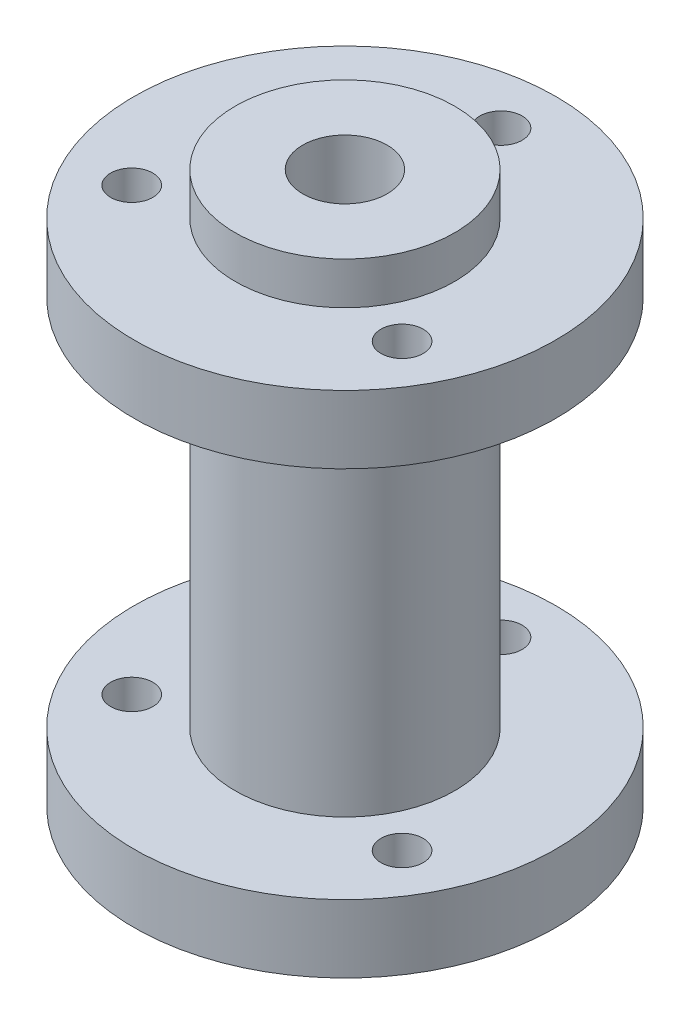
ISO-10303-21;
HEADER;
FILE_DESCRIPTION(('STEP AP214'),'2;1');
FILE_NAME('part.step','',(''),(''),'','','');
FILE_SCHEMA(('AUTOMOTIVE_DESIGN { 1 0 10303 214 1 1 1 1 }'));
ENDSEC;
DATA;
#1=APPLICATION_CONTEXT('core data for automotive mechanical design processes');
#2=APPLICATION_PROTOCOL_DEFINITION('international standard','automotive_design',2000,#1);
#3=PRODUCT_CONTEXT('',#1,'mechanical');
#4=PRODUCT('Part','Part','',(#3));
#5=PRODUCT_RELATED_PRODUCT_CATEGORY('part','',(#4));
#6=PRODUCT_DEFINITION_FORMATION('','',#4);
#7=PRODUCT_DEFINITION_CONTEXT('part definition',#1,'design');
#8=PRODUCT_DEFINITION('design','',#6,#7);
#9=PRODUCT_DEFINITION_SHAPE('','',#8);
#10=(LENGTH_UNIT() NAMED_UNIT(*) SI_UNIT(.MILLI.,.METRE.));
#11=(NAMED_UNIT(*) PLANE_ANGLE_UNIT() SI_UNIT($,.RADIAN.));
#12=(NAMED_UNIT(*) SI_UNIT($,.STERADIAN.) SOLID_ANGLE_UNIT());
#13=UNCERTAINTY_MEASURE_WITH_UNIT(LENGTH_MEASURE(1.E-05),#10,'distance_accuracy_value','');
#14=(GEOMETRIC_REPRESENTATION_CONTEXT(3) GLOBAL_UNCERTAINTY_ASSIGNED_CONTEXT((#13)) GLOBAL_UNIT_ASSIGNED_CONTEXT((#10,
#11,#12)) REPRESENTATION_CONTEXT('',''));
#15=CARTESIAN_POINT('',(0.,0.,0.));
#16=DIRECTION('',(0.,0.,1.));
#17=DIRECTION('',(1.,0.,0.));
#18=AXIS2_PLACEMENT_3D('',#15,#16,#17);
#19=CARTESIAN_POINT('',(0.,0.,0.));
#20=DIRECTION('',(0.,-1.,0.));
#21=DIRECTION('',(0.,0.,-1.));
#22=AXIS2_PLACEMENT_3D('',#19,#20,#21);
#23=CYLINDRICAL_SURFACE('',#22,4.5);
#24=CARTESIAN_POINT('',(0.,-12.56,0.));
#25=DIRECTION('',(0.,-1.,0.));
#26=DIRECTION('',(0.,0.,-1.));
#27=AXIS2_PLACEMENT_3D('',#24,#25,#26);
#28=CIRCLE('',#27,4.5);
#29=CARTESIAN_POINT('',(0.,-12.56,-4.5));
#30=VERTEX_POINT('',#29);
#31=EDGE_CURVE('E10',#30,#30,#28,.T.);
#32=ORIENTED_EDGE('',*,*,#31,.T.);
#33=EDGE_LOOP('',(#32));
#34=FACE_BOUND('',#33,.T.);
#35=CARTESIAN_POINT('',(0.,12.56,0.));
#36=DIRECTION('',(0.,-1.,0.));
#37=DIRECTION('',(0.,0.,-1.));
#38=AXIS2_PLACEMENT_3D('',#35,#36,#37);
#39=CIRCLE('',#38,4.5);
#40=CARTESIAN_POINT('',(0.,12.56,-4.5));
#41=VERTEX_POINT('',#40);
#42=EDGE_CURVE('E84',#41,#41,#39,.T.);
#43=ORIENTED_EDGE('',*,*,#42,.F.);
#44=EDGE_LOOP('',(#43));
#45=FACE_BOUND('',#44,.T.);
#46=ADVANCED_FACE('F32',(#34,#45),#23,.F.);
#47=CARTESIAN_POINT('',(2.5,-12.56,0.));
#48=DIRECTION('',(0.,1.,0.));
#49=DIRECTION('',(0.,0.,1.));
#50=AXIS2_PLACEMENT_3D('',#47,#48,#49);
#51=PLANE('',#50);
#52=CARTESIAN_POINT('',(0.,-12.56,0.));
#53=DIRECTION('',(0.,-1.,0.));
#54=DIRECTION('',(0.,0.,-1.));
#55=AXIS2_PLACEMENT_3D('',#52,#53,#54);
#56=CIRCLE('',#55,2.5);
#57=CARTESIAN_POINT('',(0.,-12.56,-2.5));
#58=VERTEX_POINT('',#57);
#59=EDGE_CURVE('E38',#58,#58,#56,.T.);
#60=ORIENTED_EDGE('',*,*,#59,.T.);
#61=EDGE_LOOP('',(#60));
#62=FACE_BOUND('',#61,.T.);
#63=ORIENTED_EDGE('',*,*,#31,.F.);
#64=EDGE_LOOP('',(#63));
#65=FACE_BOUND('',#64,.T.);
#66=ADVANCED_FACE('F193',(#62,#65),#51,.T.);
#67=CARTESIAN_POINT('',(0.,0.,0.));
#68=DIRECTION('',(0.,-1.,0.));
#69=DIRECTION('',(0.,0.,-1.));
#70=AXIS2_PLACEMENT_3D('',#67,#68,#69);
#71=CYLINDRICAL_SURFACE('',#70,2.5);
#72=CARTESIAN_POINT('',(0.,-17.56,0.));
#73=DIRECTION('',(0.,-1.,0.));
#74=DIRECTION('',(0.,0.,-1.));
#75=AXIS2_PLACEMENT_3D('',#72,#73,#74);
#76=CIRCLE('',#75,2.5);
#77=CARTESIAN_POINT('',(0.,-17.56,-2.5));
#78=VERTEX_POINT('',#77);
#79=EDGE_CURVE('E42',#78,#78,#76,.T.);
#80=ORIENTED_EDGE('',*,*,#79,.T.);
#81=EDGE_LOOP('',(#80));
#82=FACE_BOUND('',#81,.T.);
#83=ORIENTED_EDGE('',*,*,#59,.F.);
#84=EDGE_LOOP('',(#83));
#85=FACE_BOUND('',#84,.T.);
#86=ADVANCED_FACE('F187',(#82,#85),#71,.F.);
#87=CARTESIAN_POINT('',(6.495,-17.56,0.));
#88=DIRECTION('',(0.,-1.,0.));
#89=DIRECTION('',(0.,0.,-1.));
#90=AXIS2_PLACEMENT_3D('',#87,#88,#89);
#91=PLANE('',#90);
#92=CARTESIAN_POINT('',(0.,-17.56,0.));
#93=DIRECTION('',(0.,-1.,0.));
#94=DIRECTION('',(0.,0.,-1.));
#95=AXIS2_PLACEMENT_3D('',#92,#93,#94);
#96=CIRCLE('',#95,6.495);
#97=CARTESIAN_POINT('',(0.,-17.56,-6.495));
#98=VERTEX_POINT('',#97);
#99=EDGE_CURVE('E46',#98,#98,#96,.T.);
#100=ORIENTED_EDGE('',*,*,#99,.T.);
#101=EDGE_LOOP('',(#100));
#102=FACE_BOUND('',#101,.T.);
#103=ORIENTED_EDGE('',*,*,#79,.F.);
#104=EDGE_LOOP('',(#103));
#105=FACE_BOUND('',#104,.T.);
#106=ADVANCED_FACE('F181',(#102,#105),#91,.T.);
#107=CARTESIAN_POINT('',(0.,0.,0.));
#108=DIRECTION('',(0.,-1.,0.));
#109=DIRECTION('',(0.,0.,-1.));
#110=AXIS2_PLACEMENT_3D('',#107,#108,#109);
#111=CYLINDRICAL_SURFACE('',#110,6.495);
#112=CARTESIAN_POINT('',(0.,-15.06,0.));
#113=DIRECTION('',(0.,-1.,0.));
#114=DIRECTION('',(0.,0.,-1.));
#115=AXIS2_PLACEMENT_3D('',#112,#113,#114);
#116=CIRCLE('',#115,6.495);
#117=CARTESIAN_POINT('',(0.,-15.06,-6.495));
#118=VERTEX_POINT('',#117);
#119=EDGE_CURVE('E51',#118,#118,#116,.T.);
#120=ORIENTED_EDGE('',*,*,#119,.T.);
#121=EDGE_LOOP('',(#120));
#122=FACE_BOUND('',#121,.T.);
#123=ORIENTED_EDGE('',*,*,#99,.F.);
#124=EDGE_LOOP('',(#123));
#125=FACE_BOUND('',#124,.T.);
#126=ADVANCED_FACE('F174',(#122,#125),#111,.T.);
#127=CARTESIAN_POINT('',(12.485,-15.06,0.));
#128=DIRECTION('',(0.,-1.,0.));
#129=DIRECTION('',(0.,0.,-1.));
#130=AXIS2_PLACEMENT_3D('',#127,#128,#129);
#131=PLANE('',#130);
#132=CARTESIAN_POINT('',(0.,-15.06,-9.23760430703401));
#133=DIRECTION('',(0.,-1.,0.));
#134=DIRECTION('',(0.,0.,-1.));
#135=AXIS2_PLACEMENT_3D('',#132,#133,#134);
#136=CIRCLE('',#135,1.24999999999999);
#137=CARTESIAN_POINT('',(0.,-15.06,-10.487604307034));
#138=VERTEX_POINT('',#137);
#139=EDGE_CURVE('E111',#138,#138,#136,.T.);
#140=ORIENTED_EDGE('',*,*,#139,.F.);
#141=EDGE_LOOP('',(#140));
#142=FACE_BOUND('',#141,.T.);
#143=CARTESIAN_POINT('',(8.,-15.06,4.618802153517));
#144=DIRECTION('',(0.,-1.,0.));
#145=DIRECTION('',(0.,0.,-1.));
#146=AXIS2_PLACEMENT_3D('',#143,#144,#145);
#147=CIRCLE('',#146,1.24999999999999);
#148=CARTESIAN_POINT('',(8.,-15.06,3.36880215351701));
#149=VERTEX_POINT('',#148);
#150=EDGE_CURVE('E102',#149,#149,#147,.T.);
#151=ORIENTED_EDGE('',*,*,#150,.F.);
#152=EDGE_LOOP('',(#151));
#153=FACE_BOUND('',#152,.T.);
#154=CARTESIAN_POINT('',(-8.,-15.06,4.61880215351701));
#155=DIRECTION('',(0.,-1.,0.));
#156=DIRECTION('',(0.,0.,-1.));
#157=AXIS2_PLACEMENT_3D('',#154,#155,#156);
#158=CIRCLE('',#157,1.24999999999999);
#159=CARTESIAN_POINT('',(-8.,-15.06,3.36880215351702));
#160=VERTEX_POINT('',#159);
#161=EDGE_CURVE('E90',#160,#160,#158,.T.);
#162=ORIENTED_EDGE('',*,*,#161,.F.);
#163=EDGE_LOOP('',(#162));
#164=FACE_BOUND('',#163,.T.);
#165=CARTESIAN_POINT('',(0.,-15.06,0.));
#166=DIRECTION('',(0.,-1.,0.));
#167=DIRECTION('',(0.,0.,-1.));
#168=AXIS2_PLACEMENT_3D('',#165,#166,#167);
#169=CIRCLE('',#168,12.485);
#170=CARTESIAN_POINT('',(0.,-15.06,-12.485));
#171=VERTEX_POINT('',#170);
#172=EDGE_CURVE('E54',#171,#171,#169,.T.);
#173=ORIENTED_EDGE('',*,*,#172,.T.);
#174=EDGE_LOOP('',(#173));
#175=FACE_BOUND('',#174,.T.);
#176=ORIENTED_EDGE('',*,*,#119,.F.);
#177=EDGE_LOOP('',(#176));
#178=FACE_BOUND('',#177,.T.);
#179=ADVANCED_FACE('F168',(#142,#153,#164,#175,#178),#131,.T.);
#180=CARTESIAN_POINT('',(0.,0.,0.));
#181=DIRECTION('',(0.,-1.,0.));
#182=DIRECTION('',(0.,0.,-1.));
#183=AXIS2_PLACEMENT_3D('',#180,#181,#182);
#184=CYLINDRICAL_SURFACE('',#183,12.485);
#185=CARTESIAN_POINT('',(0.,-11.04,0.));
#186=DIRECTION('',(0.,-1.,0.));
#187=DIRECTION('',(0.,0.,-1.));
#188=AXIS2_PLACEMENT_3D('',#185,#186,#187);
#189=CIRCLE('',#188,12.485);
#190=CARTESIAN_POINT('',(0.,-11.04,-12.485));
#191=VERTEX_POINT('',#190);
#192=EDGE_CURVE('E57',#191,#191,#189,.T.);
#193=ORIENTED_EDGE('',*,*,#192,.T.);
#194=EDGE_LOOP('',(#193));
#195=FACE_BOUND('',#194,.T.);
#196=ORIENTED_EDGE('',*,*,#172,.F.);
#197=EDGE_LOOP('',(#196));
#198=FACE_BOUND('',#197,.T.);
#199=ADVANCED_FACE('F161',(#195,#198),#184,.T.);
#200=CARTESIAN_POINT('',(6.5,-11.04,0.));
#201=DIRECTION('',(0.,1.,0.));
#202=DIRECTION('',(0.,0.,1.));
#203=AXIS2_PLACEMENT_3D('',#200,#201,#202);
#204=PLANE('',#203);
#205=CARTESIAN_POINT('',(0.,-11.04,-9.23760430703401));
#206=DIRECTION('',(0.,1.,0.));
#207=DIRECTION('',(0.,0.,1.));
#208=AXIS2_PLACEMENT_3D('',#205,#206,#207);
#209=CIRCLE('',#208,1.24999999999999);
#210=CARTESIAN_POINT('',(0.,-11.04,-7.98760430703402));
#211=VERTEX_POINT('',#210);
#212=EDGE_CURVE('E114',#211,#211,#209,.T.);
#213=ORIENTED_EDGE('',*,*,#212,.F.);
#214=EDGE_LOOP('',(#213));
#215=FACE_BOUND('',#214,.T.);
#216=CARTESIAN_POINT('',(8.,-11.04,4.618802153517));
#217=DIRECTION('',(0.,1.,0.));
#218=DIRECTION('',(0.,0.,1.));
#219=AXIS2_PLACEMENT_3D('',#216,#217,#218);
#220=CIRCLE('',#219,1.24999999999999);
#221=CARTESIAN_POINT('',(8.,-11.04,5.868802153517));
#222=VERTEX_POINT('',#221);
#223=EDGE_CURVE('E99',#222,#222,#220,.T.);
#224=ORIENTED_EDGE('',*,*,#223,.F.);
#225=EDGE_LOOP('',(#224));
#226=FACE_BOUND('',#225,.T.);
#227=CARTESIAN_POINT('',(-8.,-11.04,4.61880215351701));
#228=DIRECTION('',(0.,1.,0.));
#229=DIRECTION('',(0.,0.,1.));
#230=AXIS2_PLACEMENT_3D('',#227,#228,#229);
#231=CIRCLE('',#230,1.24999999999999);
#232=CARTESIAN_POINT('',(-8.,-11.04,5.868802153517));
#233=VERTEX_POINT('',#232);
#234=EDGE_CURVE('E93',#233,#233,#231,.T.);
#235=ORIENTED_EDGE('',*,*,#234,.F.);
#236=EDGE_LOOP('',(#235));
#237=FACE_BOUND('',#236,.T.);
#238=CARTESIAN_POINT('',(0.,-11.04,0.));
#239=DIRECTION('',(0.,-1.,0.));
#240=DIRECTION('',(0.,0.,-1.));
#241=AXIS2_PLACEMENT_3D('',#238,#239,#240);
#242=CIRCLE('',#241,6.5);
#243=CARTESIAN_POINT('',(0.,-11.04,-6.5));
#244=VERTEX_POINT('',#243);
#245=EDGE_CURVE('E60',#244,#244,#242,.T.);
#246=ORIENTED_EDGE('',*,*,#245,.T.);
#247=EDGE_LOOP('',(#246));
#248=FACE_BOUND('',#247,.T.);
#249=ORIENTED_EDGE('',*,*,#192,.F.);
#250=EDGE_LOOP('',(#249));
#251=FACE_BOUND('',#250,.T.);
#252=ADVANCED_FACE('F155',(#215,#226,#237,#248,#251),#204,.T.);
#253=CARTESIAN_POINT('',(0.,0.,0.));
#254=DIRECTION('',(0.,-1.,0.));
#255=DIRECTION('',(0.,0.,-1.));
#256=AXIS2_PLACEMENT_3D('',#253,#254,#255);
#257=CYLINDRICAL_SURFACE('',#256,6.5);
#258=CARTESIAN_POINT('',(0.,11.04,0.));
#259=DIRECTION('',(0.,-1.,0.));
#260=DIRECTION('',(0.,0.,-1.));
#261=AXIS2_PLACEMENT_3D('',#258,#259,#260);
#262=CIRCLE('',#261,6.5);
#263=CARTESIAN_POINT('',(0.,11.04,-6.5));
#264=VERTEX_POINT('',#263);
#265=EDGE_CURVE('E63',#264,#264,#262,.T.);
#266=ORIENTED_EDGE('',*,*,#265,.T.);
#267=EDGE_LOOP('',(#266));
#268=FACE_BOUND('',#267,.T.);
#269=ORIENTED_EDGE('',*,*,#245,.F.);
#270=EDGE_LOOP('',(#269));
#271=FACE_BOUND('',#270,.T.);
#272=ADVANCED_FACE('F148',(#268,#271),#257,.T.);
#273=CARTESIAN_POINT('',(6.5,11.04,0.));
#274=DIRECTION('',(0.,-1.,0.));
#275=DIRECTION('',(0.,0.,-1.));
#276=AXIS2_PLACEMENT_3D('',#273,#274,#275);
#277=PLANE('',#276);
#278=CARTESIAN_POINT('',(0.,11.04,-9.23760430703401));
#279=DIRECTION('',(0.,-1.,0.));
#280=DIRECTION('',(0.,0.,-1.));
#281=AXIS2_PLACEMENT_3D('',#278,#279,#280);
#282=CIRCLE('',#281,1.24999999999999);
#283=CARTESIAN_POINT('',(0.,11.04,-10.487604307034));
#284=VERTEX_POINT('',#283);
#285=EDGE_CURVE('E117',#284,#284,#282,.T.);
#286=ORIENTED_EDGE('',*,*,#285,.F.);
#287=EDGE_LOOP('',(#286));
#288=FACE_BOUND('',#287,.T.);
#289=CARTESIAN_POINT('',(8.,11.04,4.618802153517));
#290=DIRECTION('',(0.,-1.,0.));
#291=DIRECTION('',(0.,0.,-1.));
#292=AXIS2_PLACEMENT_3D('',#289,#290,#291);
#293=CIRCLE('',#292,1.24999999999999);
#294=CARTESIAN_POINT('',(8.,11.04,3.36880215351701));
#295=VERTEX_POINT('',#294);
#296=EDGE_CURVE('E105',#295,#295,#293,.T.);
#297=ORIENTED_EDGE('',*,*,#296,.F.);
#298=EDGE_LOOP('',(#297));
#299=FACE_BOUND('',#298,.T.);
#300=CARTESIAN_POINT('',(-8.,11.04,4.61880215351701));
#301=DIRECTION('',(0.,-1.,0.));
#302=DIRECTION('',(0.,0.,-1.));
#303=AXIS2_PLACEMENT_3D('',#300,#301,#302);
#304=CIRCLE('',#303,1.24999999999999);
#305=CARTESIAN_POINT('',(-8.,11.04,3.36880215351702));
#306=VERTEX_POINT('',#305);
#307=EDGE_CURVE('E87',#306,#306,#304,.T.);
#308=ORIENTED_EDGE('',*,*,#307,.F.);
#309=EDGE_LOOP('',(#308));
#310=FACE_BOUND('',#309,.T.);
#311=CARTESIAN_POINT('',(0.,11.04,0.));
#312=DIRECTION('',(0.,-1.,0.));
#313=DIRECTION('',(0.,0.,-1.));
#314=AXIS2_PLACEMENT_3D('',#311,#312,#313);
#315=CIRCLE('',#314,12.485);
#316=CARTESIAN_POINT('',(0.,11.04,-12.485));
#317=VERTEX_POINT('',#316);
#318=EDGE_CURVE('E66',#317,#317,#315,.T.);
#319=ORIENTED_EDGE('',*,*,#318,.T.);
#320=EDGE_LOOP('',(#319));
#321=FACE_BOUND('',#320,.T.);
#322=ORIENTED_EDGE('',*,*,#265,.F.);
#323=EDGE_LOOP('',(#322));
#324=FACE_BOUND('',#323,.T.);
#325=ADVANCED_FACE('F142',(#288,#299,#310,#321,#324),#277,.T.);
#326=CARTESIAN_POINT('',(0.,0.,0.));
#327=DIRECTION('',(0.,-1.,0.));
#328=DIRECTION('',(0.,0.,-1.));
#329=AXIS2_PLACEMENT_3D('',#326,#327,#328);
#330=CYLINDRICAL_SURFACE('',#329,12.485);
#331=CARTESIAN_POINT('',(0.,15.06,0.));
#332=DIRECTION('',(0.,-1.,0.));
#333=DIRECTION('',(0.,0.,-1.));
#334=AXIS2_PLACEMENT_3D('',#331,#332,#333);
#335=CIRCLE('',#334,12.485);
#336=CARTESIAN_POINT('',(0.,15.06,-12.485));
#337=VERTEX_POINT('',#336);
#338=EDGE_CURVE('E69',#337,#337,#335,.T.);
#339=ORIENTED_EDGE('',*,*,#338,.T.);
#340=EDGE_LOOP('',(#339));
#341=FACE_BOUND('',#340,.T.);
#342=ORIENTED_EDGE('',*,*,#318,.F.);
#343=EDGE_LOOP('',(#342));
#344=FACE_BOUND('',#343,.T.);
#345=ADVANCED_FACE('F130',(#341,#344),#330,.T.);
#346=CARTESIAN_POINT('',(12.485,15.06,0.));
#347=DIRECTION('',(0.,1.,0.));
#348=DIRECTION('',(0.,0.,1.));
#349=AXIS2_PLACEMENT_3D('',#346,#347,#348);
#350=PLANE('',#349);
#351=CARTESIAN_POINT('',(0.,15.06,-9.23760430703401));
#352=DIRECTION('',(0.,1.,0.));
#353=DIRECTION('',(0.,0.,1.));
#354=AXIS2_PLACEMENT_3D('',#351,#352,#353);
#355=CIRCLE('',#354,1.24999999999999);
#356=CARTESIAN_POINT('',(0.,15.06,-7.98760430703403));
#357=VERTEX_POINT('',#356);
#358=EDGE_CURVE('E120',#357,#357,#355,.T.);
#359=ORIENTED_EDGE('',*,*,#358,.F.);
#360=EDGE_LOOP('',(#359));
#361=FACE_BOUND('',#360,.T.);
#362=CARTESIAN_POINT('',(8.,15.06,4.618802153517));
#363=DIRECTION('',(0.,1.,0.));
#364=DIRECTION('',(0.,0.,1.));
#365=AXIS2_PLACEMENT_3D('',#362,#363,#364);
#366=CIRCLE('',#365,1.24999999999999);
#367=CARTESIAN_POINT('',(8.,15.06,5.86880215351699));
#368=VERTEX_POINT('',#367);
#369=EDGE_CURVE('E108',#368,#368,#366,.T.);
#370=ORIENTED_EDGE('',*,*,#369,.F.);
#371=EDGE_LOOP('',(#370));
#372=FACE_BOUND('',#371,.T.);
#373=CARTESIAN_POINT('',(-8.,15.06,4.61880215351701));
#374=DIRECTION('',(0.,1.,0.));
#375=DIRECTION('',(0.,0.,1.));
#376=AXIS2_PLACEMENT_3D('',#373,#374,#375);
#377=CIRCLE('',#376,1.24999999999999);
#378=CARTESIAN_POINT('',(-8.,15.06,5.86880215351699));
#379=VERTEX_POINT('',#378);
#380=EDGE_CURVE('E96',#379,#379,#377,.T.);
#381=ORIENTED_EDGE('',*,*,#380,.F.);
#382=EDGE_LOOP('',(#381));
#383=FACE_BOUND('',#382,.T.);
#384=CARTESIAN_POINT('',(0.,15.06,0.));
#385=DIRECTION('',(0.,-1.,0.));
#386=DIRECTION('',(0.,0.,-1.));
#387=AXIS2_PLACEMENT_3D('',#384,#385,#386);
#388=CIRCLE('',#387,6.495);
#389=CARTESIAN_POINT('',(0.,15.06,-6.495));
#390=VERTEX_POINT('',#389);
#391=EDGE_CURVE('E72',#390,#390,#388,.T.);
#392=ORIENTED_EDGE('',*,*,#391,.T.);
#393=EDGE_LOOP('',(#392));
#394=FACE_BOUND('',#393,.T.);
#395=ORIENTED_EDGE('',*,*,#338,.F.);
#396=EDGE_LOOP('',(#395));
#397=FACE_BOUND('',#396,.T.);
#398=ADVANCED_FACE('F126',(#361,#372,#383,#394,#397),#350,.T.);
#399=CARTESIAN_POINT('',(0.,0.,0.));
#400=DIRECTION('',(0.,-1.,0.));
#401=DIRECTION('',(0.,0.,-1.));
#402=AXIS2_PLACEMENT_3D('',#399,#400,#401);
#403=CYLINDRICAL_SURFACE('',#402,6.495);
#404=CARTESIAN_POINT('',(0.,17.56,0.));
#405=DIRECTION('',(0.,-1.,0.));
#406=DIRECTION('',(0.,0.,-1.));
#407=AXIS2_PLACEMENT_3D('',#404,#405,#406);
#408=CIRCLE('',#407,6.495);
#409=CARTESIAN_POINT('',(0.,17.56,-6.495));
#410=VERTEX_POINT('',#409);
#411=EDGE_CURVE('E75',#410,#410,#408,.T.);
#412=ORIENTED_EDGE('',*,*,#411,.T.);
#413=EDGE_LOOP('',(#412));
#414=FACE_BOUND('',#413,.T.);
#415=ORIENTED_EDGE('',*,*,#391,.F.);
#416=EDGE_LOOP('',(#415));
#417=FACE_BOUND('',#416,.T.);
#418=ADVANCED_FACE('F129',(#414,#417),#403,.T.);
#419=CARTESIAN_POINT('',(6.495,17.56,0.));
#420=DIRECTION('',(0.,1.,0.));
#421=DIRECTION('',(0.,0.,1.));
#422=AXIS2_PLACEMENT_3D('',#419,#420,#421);
#423=PLANE('',#422);
#424=CARTESIAN_POINT('',(0.,17.56,0.));
#425=DIRECTION('',(0.,-1.,0.));
#426=DIRECTION('',(0.,0.,-1.));
#427=AXIS2_PLACEMENT_3D('',#424,#425,#426);
#428=CIRCLE('',#427,2.5);
#429=CARTESIAN_POINT('',(0.,17.56,-2.5));
#430=VERTEX_POINT('',#429);
#431=EDGE_CURVE('E78',#430,#430,#428,.T.);
#432=ORIENTED_EDGE('',*,*,#431,.T.);
#433=EDGE_LOOP('',(#432));
#434=FACE_BOUND('',#433,.T.);
#435=ORIENTED_EDGE('',*,*,#411,.F.);
#436=EDGE_LOOP('',(#435));
#437=FACE_BOUND('',#436,.T.);
#438=ADVANCED_FACE('F214',(#434,#437),#423,.T.);
#439=CARTESIAN_POINT('',(0.,0.,0.));
#440=DIRECTION('',(0.,-1.,0.));
#441=DIRECTION('',(0.,0.,-1.));
#442=AXIS2_PLACEMENT_3D('',#439,#440,#441);
#443=CYLINDRICAL_SURFACE('',#442,2.5);
#444=CARTESIAN_POINT('',(0.,12.56,0.));
#445=DIRECTION('',(0.,-1.,0.));
#446=DIRECTION('',(0.,0.,-1.));
#447=AXIS2_PLACEMENT_3D('',#444,#445,#446);
#448=CIRCLE('',#447,2.5);
#449=CARTESIAN_POINT('',(0.,12.56,-2.5));
#450=VERTEX_POINT('',#449);
#451=EDGE_CURVE('E81',#450,#450,#448,.T.);
#452=ORIENTED_EDGE('',*,*,#451,.T.);
#453=EDGE_LOOP('',(#452));
#454=FACE_BOUND('',#453,.T.);
#455=ORIENTED_EDGE('',*,*,#431,.F.);
#456=EDGE_LOOP('',(#455));
#457=FACE_BOUND('',#456,.T.);
#458=ADVANCED_FACE('F208',(#454,#457),#443,.F.);
#459=CARTESIAN_POINT('',(2.5,12.56,0.));
#460=DIRECTION('',(0.,-1.,0.));
#461=DIRECTION('',(0.,0.,-1.));
#462=AXIS2_PLACEMENT_3D('',#459,#460,#461);
#463=PLANE('',#462);
#464=ORIENTED_EDGE('',*,*,#42,.T.);
#465=EDGE_LOOP('',(#464));
#466=FACE_BOUND('',#465,.T.);
#467=ORIENTED_EDGE('',*,*,#451,.F.);
#468=EDGE_LOOP('',(#467));
#469=FACE_BOUND('',#468,.T.);
#470=ADVANCED_FACE('F204',(#466,#469),#463,.T.);
#471=CARTESIAN_POINT('',(-8.,15.06,4.61880215351701));
#472=DIRECTION('',(0.,1.,0.));
#473=DIRECTION('',(0.,0.,1.));
#474=AXIS2_PLACEMENT_3D('',#471,#472,#473);
#475=CYLINDRICAL_SURFACE('',#474,1.24999999999999);
#476=ORIENTED_EDGE('',*,*,#307,.T.);
#477=EDGE_LOOP('',(#476));
#478=FACE_BOUND('',#477,.T.);
#479=ORIENTED_EDGE('',*,*,#380,.T.);
#480=EDGE_LOOP('',(#479));
#481=FACE_BOUND('',#480,.T.);
#482=ADVANCED_FACE('F207',(#478,#481),#475,.F.);
#483=ORIENTED_EDGE('',*,*,#161,.T.);
#484=EDGE_LOOP('',(#483));
#485=FACE_BOUND('',#484,.T.);
#486=ORIENTED_EDGE('',*,*,#234,.T.);
#487=EDGE_LOOP('',(#486));
#488=FACE_BOUND('',#487,.T.);
#489=ADVANCED_FACE('F229',(#485,#488),#475,.F.);
#490=CARTESIAN_POINT('',(8.,15.06,4.618802153517));
#491=DIRECTION('',(0.,1.,0.));
#492=DIRECTION('',(0.,0.,1.));
#493=AXIS2_PLACEMENT_3D('',#490,#491,#492);
#494=CYLINDRICAL_SURFACE('',#493,1.24999999999999);
#495=ORIENTED_EDGE('',*,*,#296,.T.);
#496=EDGE_LOOP('',(#495));
#497=FACE_BOUND('',#496,.T.);
#498=ORIENTED_EDGE('',*,*,#369,.T.);
#499=EDGE_LOOP('',(#498));
#500=FACE_BOUND('',#499,.T.);
#501=ADVANCED_FACE('F232',(#497,#500),#494,.F.);
#502=ORIENTED_EDGE('',*,*,#223,.T.);
#503=EDGE_LOOP('',(#502));
#504=FACE_BOUND('',#503,.T.);
#505=ORIENTED_EDGE('',*,*,#150,.T.);
#506=EDGE_LOOP('',(#505));
#507=FACE_BOUND('',#506,.T.);
#508=ADVANCED_FACE('F236',(#504,#507),#494,.F.);
#509=CARTESIAN_POINT('',(0.,15.06,-9.23760430703401));
#510=DIRECTION('',(0.,1.,0.));
#511=DIRECTION('',(0.,0.,1.));
#512=AXIS2_PLACEMENT_3D('',#509,#510,#511);
#513=CYLINDRICAL_SURFACE('',#512,1.24999999999999);
#514=ORIENTED_EDGE('',*,*,#285,.T.);
#515=EDGE_LOOP('',(#514));
#516=FACE_BOUND('',#515,.T.);
#517=ORIENTED_EDGE('',*,*,#358,.T.);
#518=EDGE_LOOP('',(#517));
#519=FACE_BOUND('',#518,.T.);
#520=ADVANCED_FACE('F124',(#516,#519),#513,.F.);
#521=ORIENTED_EDGE('',*,*,#139,.T.);
#522=EDGE_LOOP('',(#521));
#523=FACE_BOUND('',#522,.T.);
#524=ORIENTED_EDGE('',*,*,#212,.T.);
#525=EDGE_LOOP('',(#524));
#526=FACE_BOUND('',#525,.T.);
#527=ADVANCED_FACE('F239',(#523,#526),#513,.F.);
#528=CLOSED_SHELL('',(#46,#66,#86,#106,#126,#179,#199,#252,#272,#325,#345,#398,#418,#438,#458,
#470,#482,#489,#501,#508,#520,#527));
#529=MANIFOLD_SOLID_BREP('B2',#528);
#530=ADVANCED_BREP_SHAPE_REPRESENTATION('',(#18,#529),#14);
#531=SHAPE_DEFINITION_REPRESENTATION(#9,#530);
ENDSEC;
END-ISO-10303-21;
